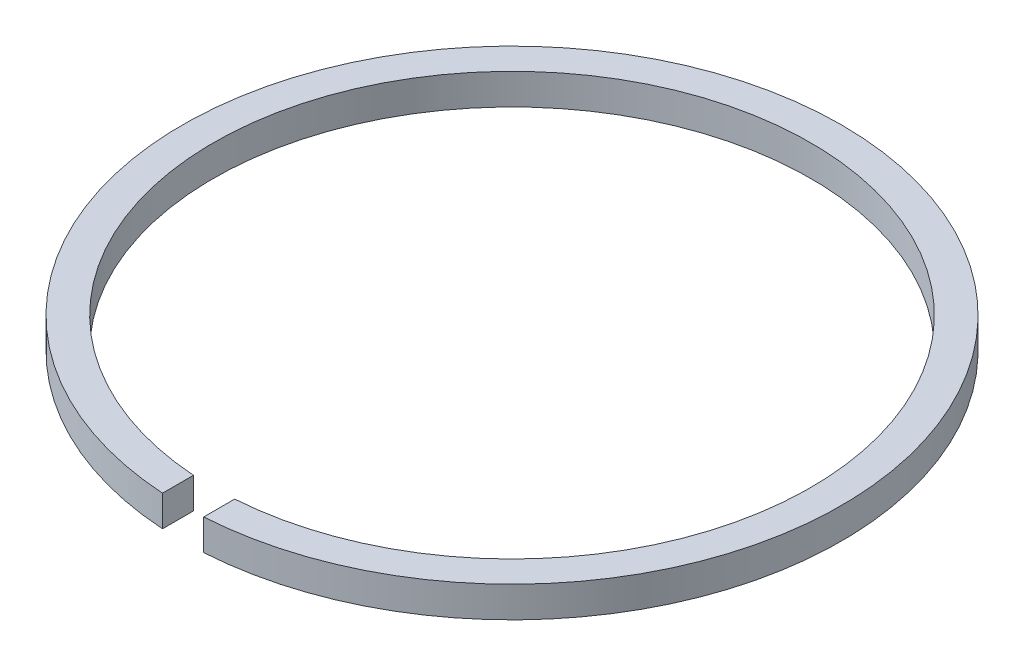
ISO-10303-21;
HEADER;
FILE_DESCRIPTION(('STEP AP214'),'2;1');
FILE_NAME('part.step','',(''),(''),'','','');
FILE_SCHEMA(('AUTOMOTIVE_DESIGN { 1 0 10303 214 1 1 1 1 }'));
ENDSEC;
DATA;
#1=APPLICATION_CONTEXT('core data for automotive mechanical design processes');
#2=APPLICATION_PROTOCOL_DEFINITION('international standard','automotive_design',2000,#1);
#3=PRODUCT_CONTEXT('',#1,'mechanical');
#4=PRODUCT('Part','Part','',(#3));
#5=PRODUCT_RELATED_PRODUCT_CATEGORY('part','',(#4));
#6=PRODUCT_DEFINITION_FORMATION('','',#4);
#7=PRODUCT_DEFINITION_CONTEXT('part definition',#1,'design');
#8=PRODUCT_DEFINITION('design','',#6,#7);
#9=PRODUCT_DEFINITION_SHAPE('','',#8);
#10=(LENGTH_UNIT() NAMED_UNIT(*) SI_UNIT(.MILLI.,.METRE.));
#11=(NAMED_UNIT(*) PLANE_ANGLE_UNIT() SI_UNIT($,.RADIAN.));
#12=(NAMED_UNIT(*) SI_UNIT($,.STERADIAN.) SOLID_ANGLE_UNIT());
#13=UNCERTAINTY_MEASURE_WITH_UNIT(LENGTH_MEASURE(1.E-05),#10,'distance_accuracy_value','');
#14=(GEOMETRIC_REPRESENTATION_CONTEXT(3) GLOBAL_UNCERTAINTY_ASSIGNED_CONTEXT((#13)) GLOBAL_UNIT_ASSIGNED_CONTEXT((#10,
#11,#12)) REPRESENTATION_CONTEXT('',''));
#15=CARTESIAN_POINT('',(0.,0.,0.));
#16=DIRECTION('',(0.,0.,1.));
#17=DIRECTION('',(1.,0.,0.));
#18=AXIS2_PLACEMENT_3D('',#15,#16,#17);
#19=CARTESIAN_POINT('',(0.,0.75,0.));
#20=DIRECTION('',(0.,-1.,0.));
#21=DIRECTION('',(0.,0.,-1.));
#22=AXIS2_PLACEMENT_3D('',#19,#20,#21);
#23=CYLINDRICAL_SURFACE('',#22,14.5);
#24=CARTESIAN_POINT('',(0.,-0.75,0.));
#25=DIRECTION('',(0.,-1.,0.));
#26=DIRECTION('',(0.,0.,1.));
#27=AXIS2_PLACEMENT_3D('',#24,#25,#26);
#28=CIRCLE('',#27,14.5);
#29=CARTESIAN_POINT('',(-0.999999999999996,-0.75,14.4654761414894));
#30=VERTEX_POINT('',#29);
#31=CARTESIAN_POINT('',(0.999999999999996,-0.75,14.4654761414894));
#32=VERTEX_POINT('',#31);
#33=EDGE_CURVE('E111',#30,#32,#28,.T.);
#34=ORIENTED_EDGE('',*,*,#33,.T.);
#35=DIRECTION('',(0.,-1.,0.));
#36=VECTOR('',#35,1.);
#37=CARTESIAN_POINT('',(0.999999999999996,0.75,14.4654761414894));
#38=LINE('',#37,#36);
#39=CARTESIAN_POINT('',(0.999999999999996,0.75,14.4654761414894));
#40=VERTEX_POINT('',#39);
#41=EDGE_CURVE('E11',#40,#32,#38,.T.);
#42=ORIENTED_EDGE('',*,*,#41,.F.);
#43=CARTESIAN_POINT('',(0.,0.75,0.));
#44=DIRECTION('',(0.,-1.,0.));
#45=DIRECTION('',(0.,0.,1.));
#46=AXIS2_PLACEMENT_3D('',#43,#44,#45);
#47=CIRCLE('',#46,14.5);
#48=CARTESIAN_POINT('',(-0.999999999999996,0.75,14.4654761414894));
#49=VERTEX_POINT('',#48);
#50=EDGE_CURVE('E95',#49,#40,#47,.T.);
#51=ORIENTED_EDGE('',*,*,#50,.F.);
#52=DIRECTION('',(0.,-1.,0.));
#53=VECTOR('',#52,1.);
#54=CARTESIAN_POINT('',(-0.999999999999996,0.75,14.4654761414894));
#55=LINE('',#54,#53);
#56=EDGE_CURVE('E107',#49,#30,#55,.T.);
#57=ORIENTED_EDGE('',*,*,#56,.T.);
#58=EDGE_LOOP('',(#34,#42,#51,#57));
#59=FACE_BOUND('',#58,.T.);
#60=ADVANCED_FACE('F43',(#59),#23,.F.);
#61=CARTESIAN_POINT('',(0.999999999999996,0.75,14.4654761414894));
#62=DIRECTION('',(1.,0.,0.));
#63=DIRECTION('',(0.,0.,-1.));
#64=AXIS2_PLACEMENT_3D('',#61,#62,#63);
#65=PLANE('',#64);
#66=DIRECTION('',(0.,0.,1.));
#67=VECTOR('',#66,1.);
#68=CARTESIAN_POINT('',(0.999999999999996,-0.75,14.4654761414894));
#69=LINE('',#68,#67);
#70=CARTESIAN_POINT('',(0.999999999999996,-0.75,15.9687194226713));
#71=VERTEX_POINT('',#70);
#72=EDGE_CURVE('E100',#32,#71,#69,.T.);
#73=ORIENTED_EDGE('',*,*,#72,.T.);
#74=DIRECTION('',(0.,-1.,0.));
#75=VECTOR('',#74,1.);
#76=CARTESIAN_POINT('',(0.999999999999996,0.75,15.9687194226713));
#77=LINE('',#76,#75);
#78=CARTESIAN_POINT('',(0.999999999999996,0.75,15.9687194226713));
#79=VERTEX_POINT('',#78);
#80=EDGE_CURVE('E52',#79,#71,#77,.T.);
#81=ORIENTED_EDGE('',*,*,#80,.F.);
#82=DIRECTION('',(0.,0.,1.));
#83=VECTOR('',#82,1.);
#84=CARTESIAN_POINT('',(0.999999999999996,0.75,14.4654761414894));
#85=LINE('',#84,#83);
#86=EDGE_CURVE('E90',#40,#79,#85,.T.);
#87=ORIENTED_EDGE('',*,*,#86,.F.);
#88=ORIENTED_EDGE('',*,*,#41,.T.);
#89=EDGE_LOOP('',(#73,#81,#87,#88));
#90=FACE_BOUND('',#89,.T.);
#91=ADVANCED_FACE('F99',(#90),#65,.F.);
#92=CARTESIAN_POINT('',(0.,0.75,0.));
#93=DIRECTION('',(0.,-1.,0.));
#94=DIRECTION('',(0.,0.,-1.));
#95=AXIS2_PLACEMENT_3D('',#92,#93,#94);
#96=CYLINDRICAL_SURFACE('',#95,16.);
#97=CARTESIAN_POINT('',(0.,-0.75,0.));
#98=DIRECTION('',(0.,1.,0.));
#99=DIRECTION('',(0.,0.,1.));
#100=AXIS2_PLACEMENT_3D('',#97,#98,#99);
#101=CIRCLE('',#100,16.);
#102=CARTESIAN_POINT('',(-0.999999999999997,-0.75,15.9687194226713));
#103=VERTEX_POINT('',#102);
#104=EDGE_CURVE('E77',#71,#103,#101,.T.);
#105=ORIENTED_EDGE('',*,*,#104,.T.);
#106=DIRECTION('',(0.,-1.,0.));
#107=VECTOR('',#106,1.);
#108=CARTESIAN_POINT('',(-0.999999999999997,0.75,15.9687194226713));
#109=LINE('',#108,#107);
#110=CARTESIAN_POINT('',(-0.999999999999997,0.75,15.9687194226713));
#111=VERTEX_POINT('',#110);
#112=EDGE_CURVE('E102',#111,#103,#109,.T.);
#113=ORIENTED_EDGE('',*,*,#112,.F.);
#114=CARTESIAN_POINT('',(0.,0.75,0.));
#115=DIRECTION('',(0.,1.,0.));
#116=DIRECTION('',(0.,0.,1.));
#117=AXIS2_PLACEMENT_3D('',#114,#115,#116);
#118=CIRCLE('',#117,16.);
#119=EDGE_CURVE('E93',#79,#111,#118,.T.);
#120=ORIENTED_EDGE('',*,*,#119,.F.);
#121=ORIENTED_EDGE('',*,*,#80,.T.);
#122=EDGE_LOOP('',(#105,#113,#120,#121));
#123=FACE_BOUND('',#122,.T.);
#124=ADVANCED_FACE('F103',(#123),#96,.T.);
#125=CARTESIAN_POINT('',(-0.999999999999996,0.75,14.4654761414894));
#126=DIRECTION('',(-1.,0.,0.));
#127=DIRECTION('',(0.,0.,1.));
#128=AXIS2_PLACEMENT_3D('',#125,#126,#127);
#129=PLANE('',#128);
#130=DIRECTION('',(0.,0.,-1.));
#131=VECTOR('',#130,1.);
#132=CARTESIAN_POINT('',(-0.999999999999996,-0.75,14.4654761414894));
#133=LINE('',#132,#131);
#134=EDGE_CURVE('E83',#103,#30,#133,.T.);
#135=ORIENTED_EDGE('',*,*,#134,.T.);
#136=ORIENTED_EDGE('',*,*,#56,.F.);
#137=DIRECTION('',(0.,0.,-1.));
#138=VECTOR('',#137,1.);
#139=CARTESIAN_POINT('',(-0.999999999999996,0.75,14.4654761414894));
#140=LINE('',#139,#138);
#141=EDGE_CURVE('E60',#111,#49,#140,.T.);
#142=ORIENTED_EDGE('',*,*,#141,.F.);
#143=ORIENTED_EDGE('',*,*,#112,.T.);
#144=EDGE_LOOP('',(#135,#136,#142,#143));
#145=FACE_BOUND('',#144,.T.);
#146=ADVANCED_FACE('F124',(#145),#129,.F.);
#147=CARTESIAN_POINT('',(0.,0.75,0.));
#148=DIRECTION('',(0.,1.,0.));
#149=DIRECTION('',(0.,0.,1.));
#150=AXIS2_PLACEMENT_3D('',#147,#148,#149);
#151=PLANE('',#150);
#152=ORIENTED_EDGE('',*,*,#50,.T.);
#153=ORIENTED_EDGE('',*,*,#86,.T.);
#154=ORIENTED_EDGE('',*,*,#119,.T.);
#155=ORIENTED_EDGE('',*,*,#141,.T.);
#156=EDGE_LOOP('',(#152,#153,#154,#155));
#157=FACE_BOUND('',#156,.T.);
#158=ADVANCED_FACE('F91',(#157),#151,.T.);
#159=CARTESIAN_POINT('',(0.,-0.75,0.));
#160=DIRECTION('',(0.,1.,0.));
#161=DIRECTION('',(0.,0.,1.));
#162=AXIS2_PLACEMENT_3D('',#159,#160,#161);
#163=PLANE('',#162);
#164=ORIENTED_EDGE('',*,*,#33,.F.);
#165=ORIENTED_EDGE('',*,*,#134,.F.);
#166=ORIENTED_EDGE('',*,*,#104,.F.);
#167=ORIENTED_EDGE('',*,*,#72,.F.);
#168=EDGE_LOOP('',(#164,#165,#166,#167));
#169=FACE_BOUND('',#168,.T.);
#170=ADVANCED_FACE('F127',(#169),#163,.F.);
#171=CLOSED_SHELL('',(#60,#91,#124,#146,#158,#170));
#172=MANIFOLD_SOLID_BREP('B2',#171);
#173=ADVANCED_BREP_SHAPE_REPRESENTATION('',(#18,#172),#14);
#174=SHAPE_DEFINITION_REPRESENTATION(#9,#173);
ENDSEC;
END-ISO-10303-21;
